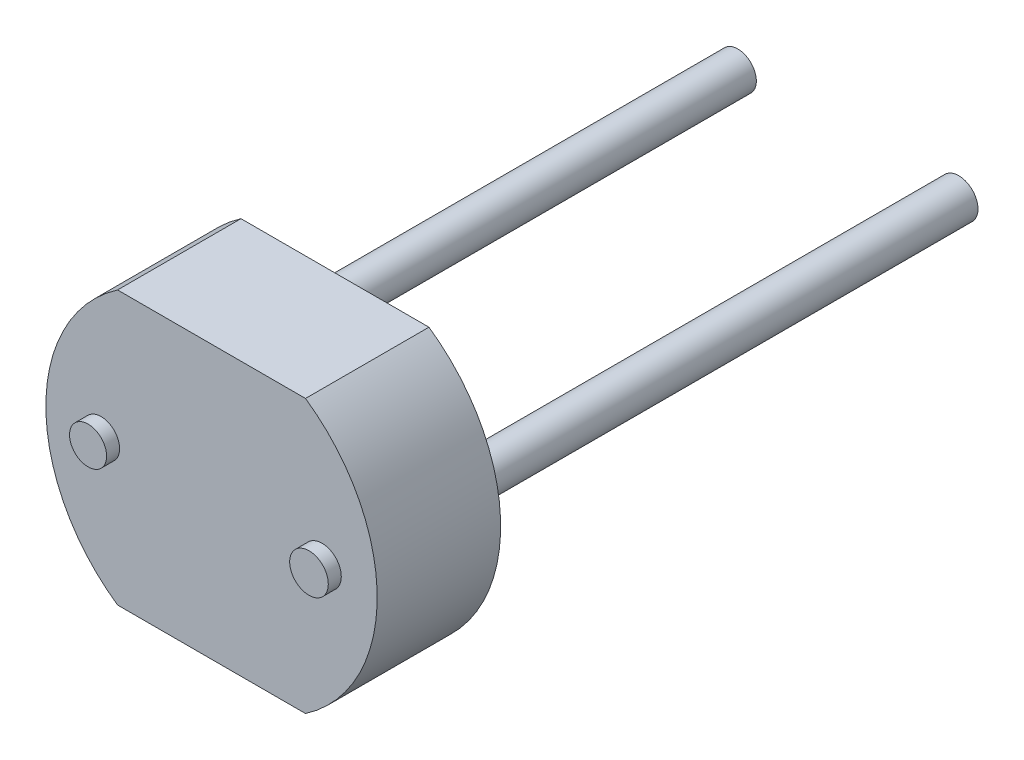
ISO-10303-21;
HEADER;
FILE_DESCRIPTION(('STEP AP214'),'2;1');
FILE_NAME('part.step','',(''),(''),'','','');
FILE_SCHEMA(('AUTOMOTIVE_DESIGN { 1 0 10303 214 1 1 1 1 }'));
ENDSEC;
DATA;
#1=APPLICATION_CONTEXT('core data for automotive mechanical design processes');
#2=APPLICATION_PROTOCOL_DEFINITION('international standard','automotive_design',2000,#1);
#3=PRODUCT_CONTEXT('',#1,'mechanical');
#4=PRODUCT('Part','Part','',(#3));
#5=PRODUCT_RELATED_PRODUCT_CATEGORY('part','',(#4));
#6=PRODUCT_DEFINITION_FORMATION('','',#4);
#7=PRODUCT_DEFINITION_CONTEXT('part definition',#1,'design');
#8=PRODUCT_DEFINITION('design','',#6,#7);
#9=PRODUCT_DEFINITION_SHAPE('','',#8);
#10=(LENGTH_UNIT() NAMED_UNIT(*) SI_UNIT(.MILLI.,.METRE.));
#11=(NAMED_UNIT(*) PLANE_ANGLE_UNIT() SI_UNIT($,.RADIAN.));
#12=(NAMED_UNIT(*) SI_UNIT($,.STERADIAN.) SOLID_ANGLE_UNIT());
#13=UNCERTAINTY_MEASURE_WITH_UNIT(LENGTH_MEASURE(1.E-05),#10,'distance_accuracy_value','');
#14=(GEOMETRIC_REPRESENTATION_CONTEXT(3) GLOBAL_UNCERTAINTY_ASSIGNED_CONTEXT((#13)) GLOBAL_UNIT_ASSIGNED_CONTEXT((#10,
#11,#12)) REPRESENTATION_CONTEXT('',''));
#15=CARTESIAN_POINT('',(0.,0.,0.));
#16=DIRECTION('',(0.,0.,1.));
#17=DIRECTION('',(1.,0.,0.));
#18=AXIS2_PLACEMENT_3D('',#15,#16,#17);
#19=CARTESIAN_POINT('',(0.,-0.449999999999997,1.9));
#20=DIRECTION('',(0.,0.,-1.));
#21=DIRECTION('',(-1.,0.,0.));
#22=AXIS2_PLACEMENT_3D('',#19,#20,#21);
#23=CYLINDRICAL_SURFACE('',#22,2.55);
#24=CARTESIAN_POINT('',(0.,-0.449999999999997,0.));
#25=DIRECTION('',(0.,0.,1.));
#26=DIRECTION('',(1.,0.,0.));
#27=AXIS2_PLACEMENT_3D('',#24,#25,#26);
#28=CIRCLE('',#27,2.55);
#29=CARTESIAN_POINT('',(-1.44654761414895,1.65,0.));
#30=VERTEX_POINT('',#29);
#31=CARTESIAN_POINT('',(-1.44654761414893,-2.55,0.));
#32=VERTEX_POINT('',#31);
#33=EDGE_CURVE('E112',#30,#32,#28,.T.);
#34=ORIENTED_EDGE('',*,*,#33,.T.);
#35=DIRECTION('',(0.,0.,-1.));
#36=VECTOR('',#35,1.);
#37=CARTESIAN_POINT('',(-1.44654761414893,-2.55,1.9));
#38=LINE('',#37,#36);
#39=CARTESIAN_POINT('',(-1.44654761414893,-2.55,1.9));
#40=VERTEX_POINT('',#39);
#41=EDGE_CURVE('E103',#40,#32,#38,.T.);
#42=ORIENTED_EDGE('',*,*,#41,.F.);
#43=CARTESIAN_POINT('',(0.,-0.449999999999997,1.9));
#44=DIRECTION('',(0.,0.,1.));
#45=DIRECTION('',(1.,0.,0.));
#46=AXIS2_PLACEMENT_3D('',#43,#44,#45);
#47=CIRCLE('',#46,2.55);
#48=CARTESIAN_POINT('',(-1.44654761414895,1.65,1.9));
#49=VERTEX_POINT('',#48);
#50=EDGE_CURVE('E97',#49,#40,#47,.T.);
#51=ORIENTED_EDGE('',*,*,#50,.F.);
#52=DIRECTION('',(0.,0.,-1.));
#53=VECTOR('',#52,1.);
#54=CARTESIAN_POINT('',(-1.44654761414895,1.65,1.9));
#55=LINE('',#54,#53);
#56=EDGE_CURVE('E108',#49,#30,#55,.T.);
#57=ORIENTED_EDGE('',*,*,#56,.T.);
#58=EDGE_LOOP('',(#34,#42,#51,#57));
#59=FACE_BOUND('',#58,.T.);
#60=ADVANCED_FACE('F43',(#59),#23,.T.);
#61=CARTESIAN_POINT('',(-1.44654761414893,-2.55,1.9));
#62=DIRECTION('',(0.,1.,0.));
#63=DIRECTION('',(-1.,0.,0.));
#64=AXIS2_PLACEMENT_3D('',#61,#62,#63);
#65=PLANE('',#64);
#66=DIRECTION('',(1.,0.,0.));
#67=VECTOR('',#66,1.);
#68=CARTESIAN_POINT('',(-1.44654761414893,-2.55,0.));
#69=LINE('',#68,#67);
#70=CARTESIAN_POINT('',(1.44654761414895,-2.54999999999999,0.));
#71=VERTEX_POINT('',#70);
#72=EDGE_CURVE('E102',#32,#71,#69,.T.);
#73=ORIENTED_EDGE('',*,*,#72,.T.);
#74=DIRECTION('',(0.,0.,-1.));
#75=VECTOR('',#74,1.);
#76=CARTESIAN_POINT('',(1.44654761414895,-2.54999999999999,1.9));
#77=LINE('',#76,#75);
#78=CARTESIAN_POINT('',(1.44654761414895,-2.54999999999999,1.9));
#79=VERTEX_POINT('',#78);
#80=EDGE_CURVE('E100',#79,#71,#77,.T.);
#81=ORIENTED_EDGE('',*,*,#80,.F.);
#82=DIRECTION('',(1.,0.,0.));
#83=VECTOR('',#82,1.);
#84=CARTESIAN_POINT('',(-1.44654761414893,-2.55,1.9));
#85=LINE('',#84,#83);
#86=EDGE_CURVE('E92',#40,#79,#85,.T.);
#87=ORIENTED_EDGE('',*,*,#86,.F.);
#88=ORIENTED_EDGE('',*,*,#41,.T.);
#89=EDGE_LOOP('',(#73,#81,#87,#88));
#90=FACE_BOUND('',#89,.T.);
#91=ADVANCED_FACE('F101',(#90),#65,.F.);
#92=CARTESIAN_POINT('',(0.,-0.449999999999997,1.9));
#93=DIRECTION('',(0.,0.,-1.));
#94=DIRECTION('',(-1.,0.,0.));
#95=AXIS2_PLACEMENT_3D('',#92,#93,#94);
#96=CYLINDRICAL_SURFACE('',#95,2.55);
#97=CARTESIAN_POINT('',(0.,-0.449999999999997,0.));
#98=DIRECTION('',(0.,0.,1.));
#99=DIRECTION('',(1.,0.,0.));
#100=AXIS2_PLACEMENT_3D('',#97,#98,#99);
#101=CIRCLE('',#100,2.55);
#102=CARTESIAN_POINT('',(1.44654761414894,1.65000000000001,0.));
#103=VERTEX_POINT('',#102);
#104=EDGE_CURVE('E78',#71,#103,#101,.T.);
#105=ORIENTED_EDGE('',*,*,#104,.T.);
#106=DIRECTION('',(0.,0.,-1.));
#107=VECTOR('',#106,1.);
#108=CARTESIAN_POINT('',(1.44654761414894,1.65000000000001,1.9));
#109=LINE('',#108,#107);
#110=CARTESIAN_POINT('',(1.44654761414894,1.65000000000001,1.9));
#111=VERTEX_POINT('',#110);
#112=EDGE_CURVE('E104',#111,#103,#109,.T.);
#113=ORIENTED_EDGE('',*,*,#112,.F.);
#114=CARTESIAN_POINT('',(0.,-0.449999999999997,1.9));
#115=DIRECTION('',(0.,0.,1.));
#116=DIRECTION('',(1.,0.,0.));
#117=AXIS2_PLACEMENT_3D('',#114,#115,#116);
#118=CIRCLE('',#117,2.55);
#119=EDGE_CURVE('E95',#79,#111,#118,.T.);
#120=ORIENTED_EDGE('',*,*,#119,.F.);
#121=ORIENTED_EDGE('',*,*,#80,.T.);
#122=EDGE_LOOP('',(#105,#113,#120,#121));
#123=FACE_BOUND('',#122,.T.);
#124=ADVANCED_FACE('F106',(#123),#96,.T.);
#125=CARTESIAN_POINT('',(-1.44654761414895,1.65,1.9));
#126=DIRECTION('',(0.,-1.,0.));
#127=DIRECTION('',(1.,0.,0.));
#128=AXIS2_PLACEMENT_3D('',#125,#126,#127);
#129=PLANE('',#128);
#130=DIRECTION('',(-1.,0.,0.));
#131=VECTOR('',#130,1.);
#132=CARTESIAN_POINT('',(-1.44654761414895,1.65,0.));
#133=LINE('',#132,#131);
#134=EDGE_CURVE('E84',#103,#30,#133,.T.);
#135=ORIENTED_EDGE('',*,*,#134,.T.);
#136=ORIENTED_EDGE('',*,*,#56,.F.);
#137=DIRECTION('',(-1.,0.,0.));
#138=VECTOR('',#137,1.);
#139=CARTESIAN_POINT('',(-1.44654761414895,1.65,1.9));
#140=LINE('',#139,#138);
#141=EDGE_CURVE('E61',#111,#49,#140,.T.);
#142=ORIENTED_EDGE('',*,*,#141,.F.);
#143=ORIENTED_EDGE('',*,*,#112,.T.);
#144=EDGE_LOOP('',(#135,#136,#142,#143));
#145=FACE_BOUND('',#144,.T.);
#146=ADVANCED_FACE('F148',(#145),#129,.F.);
#147=CARTESIAN_POINT('',(0.,-0.449999999999997,1.9));
#148=DIRECTION('',(0.,0.,1.));
#149=DIRECTION('',(1.,0.,0.));
#150=AXIS2_PLACEMENT_3D('',#147,#148,#149);
#151=PLANE('',#150);
#152=CARTESIAN_POINT('',(1.7,-0.449999999999993,1.9));
#153=DIRECTION('',(0.,0.,1.));
#154=DIRECTION('',(1.,0.,0.));
#155=AXIS2_PLACEMENT_3D('',#152,#153,#154);
#156=CIRCLE('',#155,0.297205440917142);
#157=CARTESIAN_POINT('',(1.99720544091714,-0.449999999999993,1.9));
#158=VERTEX_POINT('',#157);
#159=EDGE_CURVE('E11',#158,#158,#156,.T.);
#160=ORIENTED_EDGE('',*,*,#159,.F.);
#161=EDGE_LOOP('',(#160));
#162=FACE_BOUND('',#161,.T.);
#163=CARTESIAN_POINT('',(-1.7,-0.450000000000004,1.9));
#164=DIRECTION('',(0.,0.,1.));
#165=DIRECTION('',(1.,0.,0.));
#166=AXIS2_PLACEMENT_3D('',#163,#164,#165);
#167=CIRCLE('',#166,0.285630525318281);
#168=CARTESIAN_POINT('',(-1.41436947468172,-0.450000000000004,1.9));
#169=VERTEX_POINT('',#168);
#170=EDGE_CURVE('E52',#169,#169,#167,.T.);
#171=ORIENTED_EDGE('',*,*,#170,.F.);
#172=EDGE_LOOP('',(#171));
#173=FACE_BOUND('',#172,.T.);
#174=ORIENTED_EDGE('',*,*,#50,.T.);
#175=ORIENTED_EDGE('',*,*,#86,.T.);
#176=ORIENTED_EDGE('',*,*,#119,.T.);
#177=ORIENTED_EDGE('',*,*,#141,.T.);
#178=EDGE_LOOP('',(#174,#175,#176,#177));
#179=FACE_BOUND('',#178,.T.);
#180=ADVANCED_FACE('F93',(#162,#173,#179),#151,.T.);
#181=CARTESIAN_POINT('',(0.,-0.449999999999997,0.));
#182=DIRECTION('',(0.,0.,1.));
#183=DIRECTION('',(1.,0.,0.));
#184=AXIS2_PLACEMENT_3D('',#181,#182,#183);
#185=PLANE('',#184);
#186=CARTESIAN_POINT('',(1.7,-0.449999999999993,0.));
#187=DIRECTION('',(0.,0.,1.));
#188=DIRECTION('',(1.,0.,0.));
#189=AXIS2_PLACEMENT_3D('',#186,#187,#188);
#190=CIRCLE('',#189,0.297205440917142);
#191=CARTESIAN_POINT('',(1.99720544091714,-0.449999999999993,0.));
#192=VERTEX_POINT('',#191);
#193=EDGE_CURVE('E46',#192,#192,#190,.T.);
#194=ORIENTED_EDGE('',*,*,#193,.T.);
#195=EDGE_LOOP('',(#194));
#196=FACE_BOUND('',#195,.T.);
#197=CARTESIAN_POINT('',(-1.7,-0.450000000000004,0.));
#198=DIRECTION('',(0.,0.,1.));
#199=DIRECTION('',(1.,0.,0.));
#200=AXIS2_PLACEMENT_3D('',#197,#198,#199);
#201=CIRCLE('',#200,0.285630525318281);
#202=CARTESIAN_POINT('',(-1.41436947468172,-0.450000000000004,0.));
#203=VERTEX_POINT('',#202);
#204=EDGE_CURVE('E120',#203,#203,#201,.T.);
#205=ORIENTED_EDGE('',*,*,#204,.T.);
#206=EDGE_LOOP('',(#205));
#207=FACE_BOUND('',#206,.T.);
#208=ORIENTED_EDGE('',*,*,#33,.F.);
#209=ORIENTED_EDGE('',*,*,#134,.F.);
#210=ORIENTED_EDGE('',*,*,#104,.F.);
#211=ORIENTED_EDGE('',*,*,#72,.F.);
#212=EDGE_LOOP('',(#208,#209,#210,#211));
#213=FACE_BOUND('',#212,.T.);
#214=ADVANCED_FACE('F147',(#196,#207,#213),#185,.F.);
#215=CARTESIAN_POINT('',(-1.7,-0.450000000000004,-7.9));
#216=DIRECTION('',(0.,0.,1.));
#217=DIRECTION('',(1.,0.,0.));
#218=AXIS2_PLACEMENT_3D('',#215,#216,#217);
#219=PLANE('',#218);
#220=CARTESIAN_POINT('',(-1.7,-0.450000000000004,-7.9));
#221=DIRECTION('',(0.,0.,1.));
#222=DIRECTION('',(1.,0.,0.));
#223=AXIS2_PLACEMENT_3D('',#220,#221,#222);
#224=CIRCLE('',#223,0.285630525318281);
#225=CARTESIAN_POINT('',(-1.41436947468172,-0.450000000000004,-7.9));
#226=VERTEX_POINT('',#225);
#227=EDGE_CURVE('E137',#226,#226,#224,.T.);
#228=ORIENTED_EDGE('',*,*,#227,.F.);
#229=EDGE_LOOP('',(#228));
#230=FACE_BOUND('',#229,.T.);
#231=ADVANCED_FACE('F155',(#230),#219,.F.);
#232=CARTESIAN_POINT('',(-1.7,-0.450000000000004,-7.9));
#233=DIRECTION('',(0.,0.,1.));
#234=DIRECTION('',(1.,0.,0.));
#235=AXIS2_PLACEMENT_3D('',#232,#233,#234);
#236=CYLINDRICAL_SURFACE('',#235,0.285630525318281);
#237=ORIENTED_EDGE('',*,*,#227,.T.);
#238=EDGE_LOOP('',(#237));
#239=FACE_BOUND('',#238,.T.);
#240=ORIENTED_EDGE('',*,*,#204,.F.);
#241=EDGE_LOOP('',(#240));
#242=FACE_BOUND('',#241,.T.);
#243=ADVANCED_FACE('F197',(#239,#242),#236,.T.);
#244=CARTESIAN_POINT('',(1.7,-0.449999999999993,-7.9));
#245=DIRECTION('',(0.,0.,1.));
#246=DIRECTION('',(1.,0.,0.));
#247=AXIS2_PLACEMENT_3D('',#244,#245,#246);
#248=PLANE('',#247);
#249=CARTESIAN_POINT('',(1.7,-0.449999999999993,-7.9));
#250=DIRECTION('',(0.,0.,1.));
#251=DIRECTION('',(1.,0.,0.));
#252=AXIS2_PLACEMENT_3D('',#249,#250,#251);
#253=CIRCLE('',#252,0.297205440917142);
#254=CARTESIAN_POINT('',(1.99720544091714,-0.449999999999993,-7.9));
#255=VERTEX_POINT('',#254);
#256=EDGE_CURVE('E122',#255,#255,#253,.T.);
#257=ORIENTED_EDGE('',*,*,#256,.F.);
#258=EDGE_LOOP('',(#257));
#259=FACE_BOUND('',#258,.T.);
#260=ADVANCED_FACE('F206',(#259),#248,.F.);
#261=CARTESIAN_POINT('',(1.7,-0.449999999999993,-7.9));
#262=DIRECTION('',(0.,0.,1.));
#263=DIRECTION('',(1.,0.,0.));
#264=AXIS2_PLACEMENT_3D('',#261,#262,#263);
#265=CYLINDRICAL_SURFACE('',#264,0.297205440917142);
#266=ORIENTED_EDGE('',*,*,#256,.T.);
#267=EDGE_LOOP('',(#266));
#268=FACE_BOUND('',#267,.T.);
#269=ORIENTED_EDGE('',*,*,#193,.F.);
#270=EDGE_LOOP('',(#269));
#271=FACE_BOUND('',#270,.T.);
#272=ADVANCED_FACE('F216',(#268,#271),#265,.T.);
#273=ORIENTED_EDGE('',*,*,#170,.T.);
#274=EDGE_LOOP('',(#273));
#275=FACE_BOUND('',#274,.T.);
#276=CARTESIAN_POINT('',(-1.7,-0.450000000000004,2.1));
#277=DIRECTION('',(0.,0.,1.));
#278=DIRECTION('',(1.,0.,0.));
#279=AXIS2_PLACEMENT_3D('',#276,#277,#278);
#280=CIRCLE('',#279,0.285630525318281);
#281=CARTESIAN_POINT('',(-1.41436947468172,-0.450000000000004,2.1));
#282=VERTEX_POINT('',#281);
#283=EDGE_CURVE('E132',#282,#282,#280,.T.);
#284=ORIENTED_EDGE('',*,*,#283,.F.);
#285=EDGE_LOOP('',(#284));
#286=FACE_BOUND('',#285,.T.);
#287=ADVANCED_FACE('F143',(#275,#286),#236,.T.);
#288=CARTESIAN_POINT('',(-1.7,-0.450000000000004,2.1));
#289=DIRECTION('',(0.,0.,1.));
#290=DIRECTION('',(1.,0.,0.));
#291=AXIS2_PLACEMENT_3D('',#288,#289,#290);
#292=PLANE('',#291);
#293=ORIENTED_EDGE('',*,*,#283,.T.);
#294=EDGE_LOOP('',(#293));
#295=FACE_BOUND('',#294,.T.);
#296=ADVANCED_FACE('F235',(#295),#292,.T.);
#297=ORIENTED_EDGE('',*,*,#159,.T.);
#298=EDGE_LOOP('',(#297));
#299=FACE_BOUND('',#298,.T.);
#300=CARTESIAN_POINT('',(1.7,-0.449999999999993,2.1));
#301=DIRECTION('',(0.,0.,1.));
#302=DIRECTION('',(1.,0.,0.));
#303=AXIS2_PLACEMENT_3D('',#300,#301,#302);
#304=CIRCLE('',#303,0.297205440917142);
#305=CARTESIAN_POINT('',(1.99720544091714,-0.449999999999993,2.1));
#306=VERTEX_POINT('',#305);
#307=EDGE_CURVE('E127',#306,#306,#304,.T.);
#308=ORIENTED_EDGE('',*,*,#307,.F.);
#309=EDGE_LOOP('',(#308));
#310=FACE_BOUND('',#309,.T.);
#311=ADVANCED_FACE('F227',(#299,#310),#265,.T.);
#312=CARTESIAN_POINT('',(1.7,-0.449999999999993,2.1));
#313=DIRECTION('',(0.,0.,1.));
#314=DIRECTION('',(1.,0.,0.));
#315=AXIS2_PLACEMENT_3D('',#312,#313,#314);
#316=PLANE('',#315);
#317=ORIENTED_EDGE('',*,*,#307,.T.);
#318=EDGE_LOOP('',(#317));
#319=FACE_BOUND('',#318,.T.);
#320=ADVANCED_FACE('F252',(#319),#316,.T.);
#321=CLOSED_SHELL('',(#60,#91,#124,#146,#180,#214,#231,#243,#260,#272,#287,#296,#311,#320));
#322=MANIFOLD_SOLID_BREP('B2',#321);
#323=ADVANCED_BREP_SHAPE_REPRESENTATION('',(#18,#322),#14);
#324=SHAPE_DEFINITION_REPRESENTATION(#9,#323);
ENDSEC;
END-ISO-10303-21;
